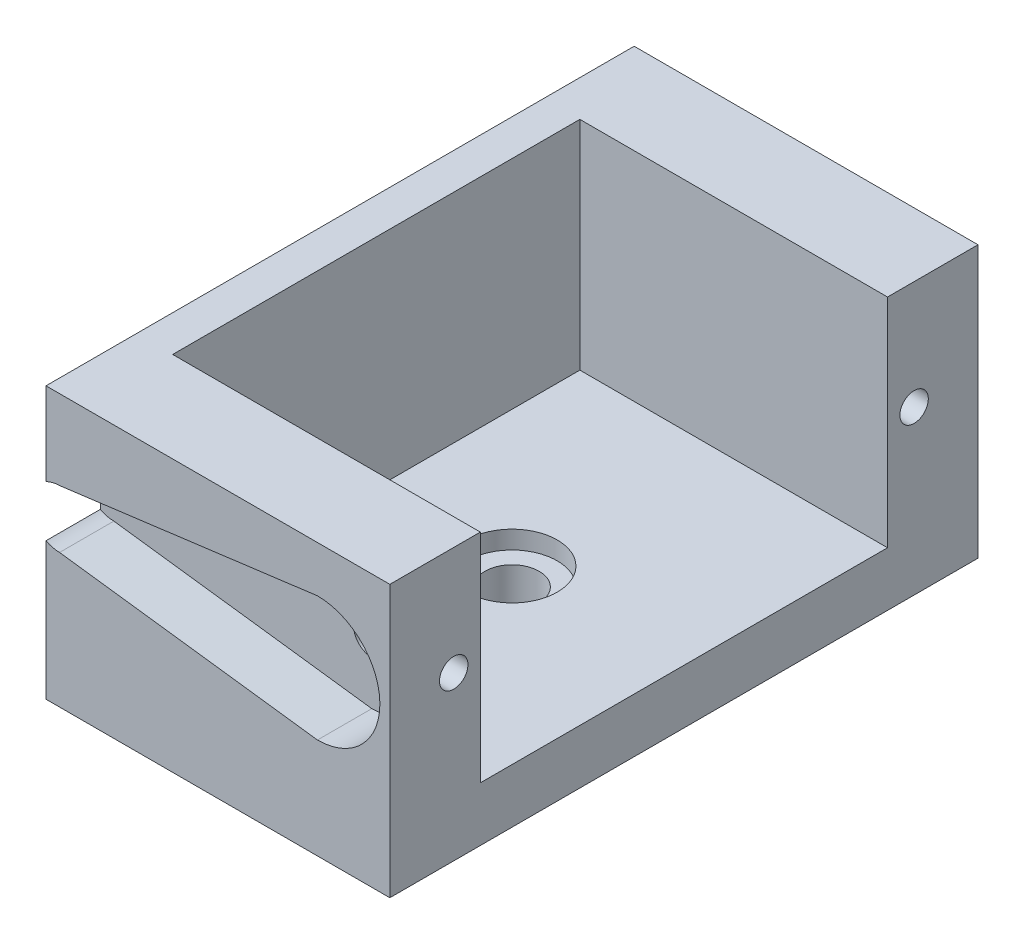
ISO-10303-21;
HEADER;
FILE_DESCRIPTION(('STEP AP214'),'2;1');
FILE_NAME('part.step','',(''),(''),'','','');
FILE_SCHEMA(('AUTOMOTIVE_DESIGN { 1 0 10303 214 1 1 1 1 }'));
ENDSEC;
DATA;
#1=APPLICATION_CONTEXT('core data for automotive mechanical design processes');
#2=APPLICATION_PROTOCOL_DEFINITION('international standard','automotive_design',2000,#1);
#3=PRODUCT_CONTEXT('',#1,'mechanical');
#4=PRODUCT('Part','Part','',(#3));
#5=PRODUCT_RELATED_PRODUCT_CATEGORY('part','',(#4));
#6=PRODUCT_DEFINITION_FORMATION('','',#4);
#7=PRODUCT_DEFINITION_CONTEXT('part definition',#1,'design');
#8=PRODUCT_DEFINITION('design','',#6,#7);
#9=PRODUCT_DEFINITION_SHAPE('','',#8);
#10=(LENGTH_UNIT() NAMED_UNIT(*) SI_UNIT(.MILLI.,.METRE.));
#11=(NAMED_UNIT(*) PLANE_ANGLE_UNIT() SI_UNIT($,.RADIAN.));
#12=(NAMED_UNIT(*) SI_UNIT($,.STERADIAN.) SOLID_ANGLE_UNIT());
#13=UNCERTAINTY_MEASURE_WITH_UNIT(LENGTH_MEASURE(1.E-05),#10,'distance_accuracy_value','');
#14=(GEOMETRIC_REPRESENTATION_CONTEXT(3) GLOBAL_UNCERTAINTY_ASSIGNED_CONTEXT((#13)) GLOBAL_UNIT_ASSIGNED_CONTEXT((#10,
#11,#12)) REPRESENTATION_CONTEXT('',''));
#15=CARTESIAN_POINT('',(0.,0.,0.));
#16=DIRECTION('',(0.,0.,1.));
#17=DIRECTION('',(1.,0.,0.));
#18=AXIS2_PLACEMENT_3D('',#15,#16,#17);
#19=CARTESIAN_POINT('',(9.50000000000006,-6.,0.));
#20=DIRECTION('',(0.,-1.,0.));
#21=DIRECTION('',(0.,0.,-1.));
#22=AXIS2_PLACEMENT_3D('',#19,#20,#21);
#23=CYLINDRICAL_SURFACE('',#22,1.5);
#24=CARTESIAN_POINT('',(9.50000000000006,-9.,0.));
#25=DIRECTION('',(0.,-1.,0.));
#26=DIRECTION('',(0.,0.,-1.));
#27=AXIS2_PLACEMENT_3D('',#24,#25,#26);
#28=CIRCLE('',#27,1.5);
#29=CARTESIAN_POINT('',(9.50000000000006,-9.,-1.5));
#30=VERTEX_POINT('',#29);
#31=EDGE_CURVE('E199',#30,#30,#28,.T.);
#32=ORIENTED_EDGE('',*,*,#31,.T.);
#33=EDGE_LOOP('',(#32));
#34=FACE_BOUND('',#33,.T.);
#35=CARTESIAN_POINT('',(9.50000000000006,-7.,0.));
#36=DIRECTION('',(0.,1.,0.));
#37=DIRECTION('',(0.,0.,1.));
#38=AXIS2_PLACEMENT_3D('',#35,#36,#37);
#39=CIRCLE('',#38,1.5);
#40=CARTESIAN_POINT('',(9.50000000000006,-7.,1.5));
#41=VERTEX_POINT('',#40);
#42=EDGE_CURVE('E51',#41,#41,#39,.F.);
#43=ORIENTED_EDGE('',*,*,#42,.F.);
#44=EDGE_LOOP('',(#43));
#45=FACE_BOUND('',#44,.T.);
#46=ADVANCED_FACE('F47',(#34,#45),#23,.F.);
#47=CARTESIAN_POINT('',(15.,0.,10.25));
#48=DIRECTION('',(0.,0.,1.));
#49=DIRECTION('',(1.,0.,0.));
#50=AXIS2_PLACEMENT_3D('',#47,#48,#49);
#51=CYLINDRICAL_SURFACE('',#50,1.);
#52=CARTESIAN_POINT('',(15.,0.,13.25));
#53=DIRECTION('',(0.,0.,1.));
#54=DIRECTION('',(1.,0.,0.));
#55=AXIS2_PLACEMENT_3D('',#52,#53,#54);
#56=CIRCLE('',#55,1.);
#57=CARTESIAN_POINT('',(16.,0.,13.25));
#58=VERTEX_POINT('',#57);
#59=EDGE_CURVE('E217',#58,#58,#56,.T.);
#60=ORIENTED_EDGE('',*,*,#59,.T.);
#61=EDGE_LOOP('',(#60));
#62=FACE_BOUND('',#61,.T.);
#63=CARTESIAN_POINT('',(15.,0.,11.75));
#64=DIRECTION('',(0.,0.,-1.));
#65=DIRECTION('',(-1.,0.,0.));
#66=AXIS2_PLACEMENT_3D('',#63,#64,#65);
#67=CIRCLE('',#66,1.);
#68=CARTESIAN_POINT('',(14.,0.,11.75));
#69=VERTEX_POINT('',#68);
#70=EDGE_CURVE('E213',#69,#69,#67,.F.);
#71=ORIENTED_EDGE('',*,*,#70,.F.);
#72=EDGE_LOOP('',(#71));
#73=FACE_BOUND('',#72,.T.);
#74=ADVANCED_FACE('F403',(#62,#73),#51,.F.);
#75=CARTESIAN_POINT('',(16.,0.,12.72));
#76=DIRECTION('',(1.,0.,0.));
#77=DIRECTION('',(0.,0.,-1.));
#78=AXIS2_PLACEMENT_3D('',#75,#76,#77);
#79=CYLINDRICAL_SURFACE('',#78,0.784999999999999);
#80=CARTESIAN_POINT('',(19.,0.,12.72));
#81=DIRECTION('',(1.,0.,0.));
#82=DIRECTION('',(0.,0.,-1.));
#83=AXIS2_PLACEMENT_3D('',#80,#81,#82);
#84=CIRCLE('',#83,0.784999999999999);
#85=CARTESIAN_POINT('',(19.,0.,11.935));
#86=VERTEX_POINT('',#85);
#87=EDGE_CURVE('E295',#86,#86,#84,.T.);
#88=ORIENTED_EDGE('',*,*,#87,.T.);
#89=EDGE_LOOP('',(#88));
#90=FACE_BOUND('',#89,.T.);
#91=DIRECTION('',(1.,0.,0.));
#92=VECTOR('',#91,1.);
#93=CARTESIAN_POINT('',(16.,0.579072534316729,13.25));
#94=LINE('',#93,#92);
#95=CARTESIAN_POINT('',(17.,0.579072534316729,13.25));
#96=VERTEX_POINT('',#95);
#97=CARTESIAN_POINT('',(18.4010549833838,0.579072534316729,13.25));
#98=VERTEX_POINT('',#97);
#99=EDGE_CURVE('E273',#96,#98,#94,.T.);
#100=ORIENTED_EDGE('',*,*,#99,.F.);
#101=CARTESIAN_POINT('',(17.,0.,12.72));
#102=DIRECTION('',(1.,0.,0.));
#103=DIRECTION('',(0.,0.,-1.));
#104=AXIS2_PLACEMENT_3D('',#101,#102,#103);
#105=CIRCLE('',#104,0.784999999999999);
#106=CARTESIAN_POINT('',(17.,-0.579072534316729,13.25));
#107=VERTEX_POINT('',#106);
#108=EDGE_CURVE('E224',#107,#96,#105,.T.);
#109=ORIENTED_EDGE('',*,*,#108,.F.);
#110=DIRECTION('',(1.,0.,0.));
#111=VECTOR('',#110,1.);
#112=CARTESIAN_POINT('',(16.,-0.579072534316729,13.25));
#113=LINE('',#112,#111);
#114=CARTESIAN_POINT('',(18.4010549833838,-0.579072534316729,13.25));
#115=VERTEX_POINT('',#114);
#116=EDGE_CURVE('E291',#115,#107,#113,.F.);
#117=ORIENTED_EDGE('',*,*,#116,.F.);
#118=CARTESIAN_POINT('',(18.4010549833838,-0.579072534316729,13.25));
#119=CARTESIAN_POINT('',(18.4061274127915,-0.54935305613086,13.2825177279916));
#120=CARTESIAN_POINT('',(18.4112484688931,-0.516857908328356,13.3124850077343));
#121=CARTESIAN_POINT('',(18.4210605751261,-0.447275442836323,13.3666061417337));
#122=CARTESIAN_POINT('',(18.4257515512325,-0.410187337183928,13.3907589963758));
#123=CARTESIAN_POINT('',(18.4341779514676,-0.332353722731534,13.4325460247221));
#124=CARTESIAN_POINT('',(18.4379125051583,-0.291604927574712,13.4501742668396));
#125=CARTESIAN_POINT('',(18.4440021609446,-0.207645046370179,13.4783315159908));
#126=CARTESIAN_POINT('',(18.4463579758924,-0.164435245445659,13.4888641920867));
#127=CARTESIAN_POINT('',(18.4493997818492,-0.0774850176345761,13.5023853226674));
#128=CARTESIAN_POINT('',(18.4501112676858,-0.0337634062835511,13.505488989142));
#129=CARTESIAN_POINT('',(18.4498602692343,0.0535823294500656,13.5043859136137));
#130=CARTESIAN_POINT('',(18.4488978407006,0.0972064570311668,13.5001794150963));
#131=CARTESIAN_POINT('',(18.4454309128946,0.182492220623079,13.4847053702288));
#132=CARTESIAN_POINT('',(18.4429478369312,0.224172611601393,13.4735358818806));
#133=CARTESIAN_POINT('',(18.4367248340911,0.305075859880942,13.4445696814052));
#134=CARTESIAN_POINT('',(18.4329844956679,0.344297907485004,13.426770799036));
#135=CARTESIAN_POINT('',(18.4247111651287,0.418598358127728,13.3854135514802));
#136=CARTESIAN_POINT('',(18.4201926735741,0.453735698185135,13.3619578572579));
#137=CARTESIAN_POINT('',(18.4107856974013,0.519780859085103,13.3097748687237));
#138=CARTESIAN_POINT('',(18.4058972918998,0.550689580389113,13.2810486997906));
#139=CARTESIAN_POINT('',(18.4010549833838,0.579072534316728,13.25));
#140=B_SPLINE_CURVE_WITH_KNOTS('',3,(#118,#119,#120,#121,#122,#123,#124,#125,#126,#127,#128,
#129,#130,#131,#132,#133,#134,#135,#136,#137,#138,#139),.UNSPECIFIED.,.F.,.F.,(4,2,2,2,2,2,2,2,
2,2,4),(0.,0.132874128128427,0.265771083660238,0.398788562022275,0.531737205173857,
0.662610276606591,0.793478989030575,0.922545096492923,1.0516534930723,1.17857484020827,
1.3054691179228),.UNSPECIFIED.);
#141=EDGE_CURVE('E11',#115,#98,#140,.T.);
#142=ORIENTED_EDGE('',*,*,#141,.T.);
#143=EDGE_LOOP('',(#100,#109,#117,#142));
#144=FACE_BOUND('',#143,.T.);
#145=ADVANCED_FACE('F369',(#90,#144),#79,.F.);
#146=CARTESIAN_POINT('',(19.,0.,11.25));
#147=DIRECTION('',(0.,0.,1.));
#148=DIRECTION('',(1.,0.,0.));
#149=AXIS2_PLACEMENT_3D('',#146,#147,#148);
#150=PLANE('',#149);
#151=CARTESIAN_POINT('',(15.,0.,11.25));
#152=DIRECTION('',(0.,0.,-1.));
#153=DIRECTION('',(-1.,0.,0.));
#154=AXIS2_PLACEMENT_3D('',#151,#152,#153);
#155=CIRCLE('',#154,1.5);
#156=CARTESIAN_POINT('',(13.5,0.,11.25));
#157=VERTEX_POINT('',#156);
#158=EDGE_CURVE('E207',#157,#157,#155,.T.);
#159=ORIENTED_EDGE('',*,*,#158,.F.);
#160=EDGE_LOOP('',(#159));
#161=FACE_BOUND('',#160,.T.);
#162=DIRECTION('',(0.,-1.,0.));
#163=VECTOR('',#162,1.);
#164=CARTESIAN_POINT('',(2.,0.,11.25));
#165=LINE('',#164,#163);
#166=CARTESIAN_POINT('',(2.,6.,11.25));
#167=VERTEX_POINT('',#166);
#168=CARTESIAN_POINT('',(2.,-6.,11.25));
#169=VERTEX_POINT('',#168);
#170=EDGE_CURVE('E358',#167,#169,#165,.T.);
#171=ORIENTED_EDGE('',*,*,#170,.F.);
#172=DIRECTION('',(-1.,0.,0.));
#173=VECTOR('',#172,1.);
#174=CARTESIAN_POINT('',(19.,6.,11.25));
#175=LINE('',#174,#173);
#176=CARTESIAN_POINT('',(19.,6.,11.25));
#177=VERTEX_POINT('',#176);
#178=EDGE_CURVE('E341',#177,#167,#175,.T.);
#179=ORIENTED_EDGE('',*,*,#178,.F.);
#180=DIRECTION('',(0.,1.,0.));
#181=VECTOR('',#180,1.);
#182=CARTESIAN_POINT('',(19.,0.,11.25));
#183=LINE('',#182,#181);
#184=CARTESIAN_POINT('',(19.,-6.,11.25));
#185=VERTEX_POINT('',#184);
#186=EDGE_CURVE('E338',#185,#177,#183,.T.);
#187=ORIENTED_EDGE('',*,*,#186,.F.);
#188=DIRECTION('',(-1.,0.,0.));
#189=VECTOR('',#188,1.);
#190=CARTESIAN_POINT('',(19.,-6.,11.25));
#191=LINE('',#190,#189);
#192=EDGE_CURVE('E350',#185,#169,#191,.T.);
#193=ORIENTED_EDGE('',*,*,#192,.T.);
#194=EDGE_LOOP('',(#171,#179,#187,#193));
#195=FACE_BOUND('',#194,.T.);
#196=ADVANCED_FACE('F479',(#161,#195),#150,.F.);
#197=CARTESIAN_POINT('',(19.,6.,0.));
#198=DIRECTION('',(0.,1.,0.));
#199=DIRECTION('',(0.,0.,1.));
#200=AXIS2_PLACEMENT_3D('',#197,#198,#199);
#201=PLANE('',#200);
#202=DIRECTION('',(0.,0.,-1.));
#203=VECTOR('',#202,1.);
#204=CARTESIAN_POINT('',(2.,6.,-16.25));
#205=LINE('',#204,#203);
#206=CARTESIAN_POINT('',(2.,6.,-11.25));
#207=VERTEX_POINT('',#206);
#208=EDGE_CURVE('E322',#167,#207,#205,.T.);
#209=ORIENTED_EDGE('',*,*,#208,.T.);
#210=DIRECTION('',(-1.,0.,0.));
#211=VECTOR('',#210,1.);
#212=CARTESIAN_POINT('',(19.,6.,-11.25));
#213=LINE('',#212,#211);
#214=CARTESIAN_POINT('',(19.,6.,-11.25));
#215=VERTEX_POINT('',#214);
#216=EDGE_CURVE('E73',#215,#207,#213,.T.);
#217=ORIENTED_EDGE('',*,*,#216,.F.);
#218=DIRECTION('',(0.,0.,-1.));
#219=VECTOR('',#218,1.);
#220=CARTESIAN_POINT('',(19.,6.,0.));
#221=LINE('',#220,#219);
#222=CARTESIAN_POINT('',(19.,6.,-16.25));
#223=VERTEX_POINT('',#222);
#224=EDGE_CURVE('E308',#215,#223,#221,.T.);
#225=ORIENTED_EDGE('',*,*,#224,.T.);
#226=DIRECTION('',(-1.,0.,0.));
#227=VECTOR('',#226,1.);
#228=CARTESIAN_POINT('',(2.,6.,-16.25));
#229=LINE('',#228,#227);
#230=CARTESIAN_POINT('',(0.,6.,-16.25));
#231=VERTEX_POINT('',#230);
#232=EDGE_CURVE('E325',#223,#231,#229,.T.);
#233=ORIENTED_EDGE('',*,*,#232,.T.);
#234=DIRECTION('',(0.,0.,-1.));
#235=VECTOR('',#234,1.);
#236=CARTESIAN_POINT('',(0.,6.,0.));
#237=LINE('',#236,#235);
#238=CARTESIAN_POINT('',(0.,6.,16.25));
#239=VERTEX_POINT('',#238);
#240=EDGE_CURVE('E173',#239,#231,#237,.T.);
#241=ORIENTED_EDGE('',*,*,#240,.F.);
#242=DIRECTION('',(-1.,0.,0.));
#243=VECTOR('',#242,1.);
#244=CARTESIAN_POINT('',(19.,6.,16.25));
#245=LINE('',#244,#243);
#246=CARTESIAN_POINT('',(19.,6.,16.25));
#247=VERTEX_POINT('',#246);
#248=EDGE_CURVE('E354',#247,#239,#245,.T.);
#249=ORIENTED_EDGE('',*,*,#248,.F.);
#250=DIRECTION('',(0.,0.,-1.));
#251=VECTOR('',#250,1.);
#252=CARTESIAN_POINT('',(19.,6.,0.));
#253=LINE('',#252,#251);
#254=EDGE_CURVE('E329',#247,#177,#253,.T.);
#255=ORIENTED_EDGE('',*,*,#254,.T.);
#256=ORIENTED_EDGE('',*,*,#178,.T.);
#257=EDGE_LOOP('',(#209,#217,#225,#233,#241,#249,#255,#256));
#258=FACE_BOUND('',#257,.T.);
#259=ADVANCED_FACE('F49',(#258),#201,.T.);
#260=CARTESIAN_POINT('',(19.,0.,16.25));
#261=DIRECTION('',(0.,0.,1.));
#262=DIRECTION('',(1.,0.,0.));
#263=AXIS2_PLACEMENT_3D('',#260,#261,#262);
#264=PLANE('',#263);
#265=CARTESIAN_POINT('',(0.749999999999999,0.,16.25));
#266=DIRECTION('',(0.,0.,1.));
#267=DIRECTION('',(1.,0.,0.));
#268=AXIS2_PLACEMENT_3D('',#265,#266,#267);
#269=CIRCLE('',#268,1.6);
#270=CARTESIAN_POINT('',(0.,-1.41332940251026,16.25));
#271=VERTEX_POINT('',#270);
#272=CARTESIAN_POINT('',(0.749999999999999,-1.6,16.25));
#273=VERTEX_POINT('',#272);
#274=EDGE_CURVE('E259',#271,#273,#269,.T.);
#275=ORIENTED_EDGE('',*,*,#274,.F.);
#276=DIRECTION('',(0.,1.,0.));
#277=VECTOR('',#276,1.);
#278=CARTESIAN_POINT('',(0.,0.,16.25));
#279=LINE('',#278,#277);
#280=CARTESIAN_POINT('',(0.,-9.,16.25));
#281=VERTEX_POINT('',#280);
#282=EDGE_CURVE('E334',#281,#271,#279,.T.);
#283=ORIENTED_EDGE('',*,*,#282,.F.);
#284=DIRECTION('',(-1.,0.,0.));
#285=VECTOR('',#284,1.);
#286=CARTESIAN_POINT('',(0.,-9.,16.25));
#287=LINE('',#286,#285);
#288=CARTESIAN_POINT('',(19.,-9.,16.25));
#289=VERTEX_POINT('',#288);
#290=EDGE_CURVE('E193',#289,#281,#287,.T.);
#291=ORIENTED_EDGE('',*,*,#290,.F.);
#292=DIRECTION('',(0.,1.,0.));
#293=VECTOR('',#292,1.);
#294=CARTESIAN_POINT('',(19.,0.,16.25));
#295=LINE('',#294,#293);
#296=EDGE_CURVE('E333',#289,#247,#295,.T.);
#297=ORIENTED_EDGE('',*,*,#296,.T.);
#298=ORIENTED_EDGE('',*,*,#248,.T.);
#299=CARTESIAN_POINT('',(0.,1.41332940251026,16.25));
#300=VERTEX_POINT('',#299);
#301=EDGE_CURVE('E344',#300,#239,#279,.T.);
#302=ORIENTED_EDGE('',*,*,#301,.F.);
#303=CARTESIAN_POINT('',(0.749999999999999,0.,16.25));
#304=DIRECTION('',(0.,0.,1.));
#305=DIRECTION('',(1.,0.,0.));
#306=AXIS2_PLACEMENT_3D('',#303,#304,#305);
#307=CIRCLE('',#306,1.6);
#308=CARTESIAN_POINT('',(0.749999999999999,1.6,16.25));
#309=VERTEX_POINT('',#308);
#310=EDGE_CURVE('E256',#309,#300,#307,.T.);
#311=ORIENTED_EDGE('',*,*,#310,.F.);
#312=DIRECTION('',(0.991677843920088,0.128744141140503,0.));
#313=VECTOR('',#312,1.);
#314=CARTESIAN_POINT('',(-0.191845049277187,1.47772537956752,16.25));
#315=LINE('',#314,#313);
#316=CARTESIAN_POINT('',(15.,3.45,16.25));
#317=VERTEX_POINT('',#316);
#318=EDGE_CURVE('E228',#309,#317,#315,.T.);
#319=ORIENTED_EDGE('',*,*,#318,.T.);
#320=CARTESIAN_POINT('',(15.,0.,16.25));
#321=DIRECTION('',(0.,0.,1.));
#322=DIRECTION('',(1.,0.,0.));
#323=AXIS2_PLACEMENT_3D('',#320,#321,#322);
#324=CIRCLE('',#323,3.45);
#325=CARTESIAN_POINT('',(15.,-3.45,16.25));
#326=VERTEX_POINT('',#325);
#327=EDGE_CURVE('E233',#326,#317,#324,.T.);
#328=ORIENTED_EDGE('',*,*,#327,.F.);
#329=DIRECTION('',(0.991677843920088,-0.128744141140503,0.));
#330=VECTOR('',#329,1.);
#331=CARTESIAN_POINT('',(-0.191845049277188,-1.47772537956752,16.25));
#332=LINE('',#331,#330);
#333=EDGE_CURVE('E263',#273,#326,#332,.T.);
#334=ORIENTED_EDGE('',*,*,#333,.F.);
#335=EDGE_LOOP('',(#275,#283,#291,#297,#298,#302,#311,#319,#328,#334));
#336=FACE_BOUND('',#335,.T.);
#337=ADVANCED_FACE('F457',(#336),#264,.T.);
#338=CARTESIAN_POINT('',(19.,0.,0.));
#339=DIRECTION('',(1.,0.,0.));
#340=DIRECTION('',(0.,0.,-1.));
#341=AXIS2_PLACEMENT_3D('',#338,#339,#340);
#342=PLANE('',#341);
#343=ORIENTED_EDGE('',*,*,#87,.F.);
#344=EDGE_LOOP('',(#343));
#345=FACE_BOUND('',#344,.T.);
#346=ORIENTED_EDGE('',*,*,#254,.F.);
#347=ORIENTED_EDGE('',*,*,#296,.F.);
#348=DIRECTION('',(0.,0.,1.));
#349=VECTOR('',#348,1.);
#350=CARTESIAN_POINT('',(19.,-9.,16.25));
#351=LINE('',#350,#349);
#352=CARTESIAN_POINT('',(19.,-9.,-16.25));
#353=VERTEX_POINT('',#352);
#354=EDGE_CURVE('E188',#353,#289,#351,.T.);
#355=ORIENTED_EDGE('',*,*,#354,.F.);
#356=DIRECTION('',(0.,1.,0.));
#357=VECTOR('',#356,1.);
#358=CARTESIAN_POINT('',(19.,0.,-16.25));
#359=LINE('',#358,#357);
#360=EDGE_CURVE('E183',#353,#223,#359,.T.);
#361=ORIENTED_EDGE('',*,*,#360,.T.);
#362=ORIENTED_EDGE('',*,*,#224,.F.);
#363=DIRECTION('',(0.,1.,0.));
#364=VECTOR('',#363,1.);
#365=CARTESIAN_POINT('',(19.,0.,-11.25));
#366=LINE('',#365,#364);
#367=CARTESIAN_POINT('',(19.,-6.,-11.25));
#368=VERTEX_POINT('',#367);
#369=EDGE_CURVE('E312',#368,#215,#366,.T.);
#370=ORIENTED_EDGE('',*,*,#369,.F.);
#371=DIRECTION('',(0.,0.,1.));
#372=VECTOR('',#371,1.);
#373=CARTESIAN_POINT('',(19.,-6.,16.25));
#374=LINE('',#373,#372);
#375=EDGE_CURVE('E195',#368,#185,#374,.T.);
#376=ORIENTED_EDGE('',*,*,#375,.T.);
#377=ORIENTED_EDGE('',*,*,#186,.T.);
#378=EDGE_LOOP('',(#346,#347,#355,#361,#362,#370,#376,#377));
#379=FACE_BOUND('',#378,.T.);
#380=CARTESIAN_POINT('',(19.,0.,-12.72));
#381=DIRECTION('',(1.,0.,0.));
#382=DIRECTION('',(0.,0.,-1.));
#383=AXIS2_PLACEMENT_3D('',#380,#381,#382);
#384=CIRCLE('',#383,0.784999999999999);
#385=CARTESIAN_POINT('',(19.,0.,-13.505));
#386=VERTEX_POINT('',#385);
#387=EDGE_CURVE('E294',#386,#386,#384,.T.);
#388=ORIENTED_EDGE('',*,*,#387,.F.);
#389=EDGE_LOOP('',(#388));
#390=FACE_BOUND('',#389,.T.);
#391=ADVANCED_FACE('F462',(#345,#379,#390),#342,.T.);
#392=CARTESIAN_POINT('',(0.,0.,0.));
#393=DIRECTION('',(1.,0.,0.));
#394=DIRECTION('',(0.,0.,-1.));
#395=AXIS2_PLACEMENT_3D('',#392,#393,#394);
#396=PLANE('',#395);
#397=ORIENTED_EDGE('',*,*,#282,.T.);
#398=DIRECTION('',(0.,0.,1.));
#399=VECTOR('',#398,1.);
#400=CARTESIAN_POINT('',(0.,-1.41332940251026,13.25));
#401=LINE('',#400,#399);
#402=CARTESIAN_POINT('',(0.,-1.41332940251026,13.25));
#403=VERTEX_POINT('',#402);
#404=EDGE_CURVE('E280',#403,#271,#401,.T.);
#405=ORIENTED_EDGE('',*,*,#404,.F.);
#406=DIRECTION('',(0.,-1.,0.));
#407=VECTOR('',#406,1.);
#408=CARTESIAN_POINT('',(0.,0.,13.25));
#409=LINE('',#408,#407);
#410=CARTESIAN_POINT('',(0.,1.41332940251026,13.25));
#411=VERTEX_POINT('',#410);
#412=EDGE_CURVE('E236',#411,#403,#409,.T.);
#413=ORIENTED_EDGE('',*,*,#412,.F.);
#414=DIRECTION('',(0.,0.,1.));
#415=VECTOR('',#414,1.);
#416=CARTESIAN_POINT('',(0.,1.41332940251026,13.25));
#417=LINE('',#416,#415);
#418=EDGE_CURVE('E283',#411,#300,#417,.T.);
#419=ORIENTED_EDGE('',*,*,#418,.T.);
#420=ORIENTED_EDGE('',*,*,#301,.T.);
#421=ORIENTED_EDGE('',*,*,#240,.T.);
#422=DIRECTION('',(0.,-1.,0.));
#423=VECTOR('',#422,1.);
#424=CARTESIAN_POINT('',(0.,6.,-16.25));
#425=LINE('',#424,#423);
#426=CARTESIAN_POINT('',(0.,-9.,-16.25));
#427=VERTEX_POINT('',#426);
#428=EDGE_CURVE('E166',#231,#427,#425,.T.);
#429=ORIENTED_EDGE('',*,*,#428,.T.);
#430=DIRECTION('',(0.,0.,-1.));
#431=VECTOR('',#430,1.);
#432=CARTESIAN_POINT('',(0.,-9.,16.25));
#433=LINE('',#432,#431);
#434=EDGE_CURVE('E171',#281,#427,#433,.T.);
#435=ORIENTED_EDGE('',*,*,#434,.F.);
#436=EDGE_LOOP('',(#397,#405,#413,#419,#420,#421,#429,#435));
#437=FACE_BOUND('',#436,.T.);
#438=ADVANCED_FACE('F169',(#437),#396,.F.);
#439=CARTESIAN_POINT('',(2.,0.,0.));
#440=DIRECTION('',(-1.,0.,0.));
#441=DIRECTION('',(0.,0.,1.));
#442=AXIS2_PLACEMENT_3D('',#439,#440,#441);
#443=PLANE('',#442);
#444=DIRECTION('',(0.,0.,1.));
#445=VECTOR('',#444,1.);
#446=CARTESIAN_POINT('',(2.,-6.,-16.25));
#447=LINE('',#446,#445);
#448=CARTESIAN_POINT('',(2.,-6.,-11.25));
#449=VERTEX_POINT('',#448);
#450=EDGE_CURVE('E177',#449,#169,#447,.T.);
#451=ORIENTED_EDGE('',*,*,#450,.F.);
#452=DIRECTION('',(0.,1.,0.));
#453=VECTOR('',#452,1.);
#454=CARTESIAN_POINT('',(2.,0.,-11.25));
#455=LINE('',#454,#453);
#456=EDGE_CURVE('E57',#449,#207,#455,.T.);
#457=ORIENTED_EDGE('',*,*,#456,.T.);
#458=ORIENTED_EDGE('',*,*,#208,.F.);
#459=ORIENTED_EDGE('',*,*,#170,.T.);
#460=EDGE_LOOP('',(#451,#457,#458,#459));
#461=FACE_BOUND('',#460,.T.);
#462=ADVANCED_FACE('F475',(#461),#443,.F.);
#463=CARTESIAN_POINT('',(2.,6.,-16.25));
#464=DIRECTION('',(0.,0.,-1.));
#465=DIRECTION('',(-1.,0.,0.));
#466=AXIS2_PLACEMENT_3D('',#463,#464,#465);
#467=PLANE('',#466);
#468=ORIENTED_EDGE('',*,*,#428,.F.);
#469=ORIENTED_EDGE('',*,*,#232,.F.);
#470=ORIENTED_EDGE('',*,*,#360,.F.);
#471=DIRECTION('',(1.,0.,0.));
#472=VECTOR('',#471,1.);
#473=CARTESIAN_POINT('',(0.,-9.,-16.25));
#474=LINE('',#473,#472);
#475=EDGE_CURVE('E180',#427,#353,#474,.T.);
#476=ORIENTED_EDGE('',*,*,#475,.F.);
#477=EDGE_LOOP('',(#468,#469,#470,#476));
#478=FACE_BOUND('',#477,.T.);
#479=ADVANCED_FACE('F181',(#478),#467,.T.);
#480=CARTESIAN_POINT('',(19.,0.,-11.25));
#481=DIRECTION('',(0.,0.,1.));
#482=DIRECTION('',(1.,0.,0.));
#483=AXIS2_PLACEMENT_3D('',#480,#481,#482);
#484=PLANE('',#483);
#485=ORIENTED_EDGE('',*,*,#456,.F.);
#486=DIRECTION('',(-1.,0.,0.));
#487=VECTOR('',#486,1.);
#488=CARTESIAN_POINT('',(19.,-6.,-11.25));
#489=LINE('',#488,#487);
#490=EDGE_CURVE('E315',#368,#449,#489,.T.);
#491=ORIENTED_EDGE('',*,*,#490,.F.);
#492=ORIENTED_EDGE('',*,*,#369,.T.);
#493=ORIENTED_EDGE('',*,*,#216,.T.);
#494=EDGE_LOOP('',(#485,#491,#492,#493));
#495=FACE_BOUND('',#494,.T.);
#496=ADVANCED_FACE('F477',(#495),#484,.T.);
#497=CARTESIAN_POINT('',(16.,0.,-12.72));
#498=DIRECTION('',(1.,0.,0.));
#499=DIRECTION('',(0.,0.,-1.));
#500=AXIS2_PLACEMENT_3D('',#497,#498,#499);
#501=CYLINDRICAL_SURFACE('',#500,0.784999999999999);
#502=CARTESIAN_POINT('',(16.,0.,-12.72));
#503=DIRECTION('',(1.,0.,0.));
#504=DIRECTION('',(0.,0.,-1.));
#505=AXIS2_PLACEMENT_3D('',#502,#503,#504);
#506=CIRCLE('',#505,0.784999999999999);
#507=CARTESIAN_POINT('',(16.,0.,-13.505));
#508=VERTEX_POINT('',#507);
#509=EDGE_CURVE('E299',#508,#508,#506,.T.);
#510=ORIENTED_EDGE('',*,*,#509,.F.);
#511=EDGE_LOOP('',(#510));
#512=FACE_BOUND('',#511,.T.);
#513=ORIENTED_EDGE('',*,*,#387,.T.);
#514=EDGE_LOOP('',(#513));
#515=FACE_BOUND('',#514,.T.);
#516=ADVANCED_FACE('F506',(#512,#515),#501,.F.);
#517=CARTESIAN_POINT('',(16.,0.,0.));
#518=DIRECTION('',(1.,0.,0.));
#519=DIRECTION('',(0.,0.,-1.));
#520=AXIS2_PLACEMENT_3D('',#517,#518,#519);
#521=PLANE('',#520);
#522=ORIENTED_EDGE('',*,*,#509,.T.);
#523=EDGE_LOOP('',(#522));
#524=FACE_BOUND('',#523,.T.);
#525=ADVANCED_FACE('F379',(#524),#521,.T.);
#526=CARTESIAN_POINT('',(15.,0.,13.25));
#527=DIRECTION('',(0.,0.,1.));
#528=DIRECTION('',(1.,0.,0.));
#529=AXIS2_PLACEMENT_3D('',#526,#527,#528);
#530=CYLINDRICAL_SURFACE('',#529,3.45);
#531=CARTESIAN_POINT('',(15.,0.,13.25));
#532=DIRECTION('',(0.,0.,1.));
#533=DIRECTION('',(1.,0.,0.));
#534=AXIS2_PLACEMENT_3D('',#531,#532,#533);
#535=CIRCLE('',#534,3.45);
#536=CARTESIAN_POINT('',(15.,-3.45,13.25));
#537=VERTEX_POINT('',#536);
#538=EDGE_CURVE('E248',#537,#115,#535,.T.);
#539=ORIENTED_EDGE('',*,*,#538,.F.);
#540=DIRECTION('',(0.,0.,1.));
#541=VECTOR('',#540,1.);
#542=CARTESIAN_POINT('',(15.,-3.45,13.25));
#543=LINE('',#542,#541);
#544=EDGE_CURVE('E274',#537,#326,#543,.T.);
#545=ORIENTED_EDGE('',*,*,#544,.T.);
#546=ORIENTED_EDGE('',*,*,#327,.T.);
#547=DIRECTION('',(0.,0.,1.));
#548=VECTOR('',#547,1.);
#549=CARTESIAN_POINT('',(15.,3.45,13.25));
#550=LINE('',#549,#548);
#551=CARTESIAN_POINT('',(15.,3.45,13.25));
#552=VERTEX_POINT('',#551);
#553=EDGE_CURVE('E270',#552,#317,#550,.T.);
#554=ORIENTED_EDGE('',*,*,#553,.F.);
#555=EDGE_CURVE('E247',#98,#552,#535,.T.);
#556=ORIENTED_EDGE('',*,*,#555,.F.);
#557=ORIENTED_EDGE('',*,*,#141,.F.);
#558=EDGE_LOOP('',(#539,#545,#546,#554,#556,#557));
#559=FACE_BOUND('',#558,.T.);
#560=ADVANCED_FACE('F373',(#559),#530,.F.);
#561=CARTESIAN_POINT('',(0.,0.,13.25));
#562=DIRECTION('',(0.,0.,1.));
#563=DIRECTION('',(1.,0.,0.));
#564=AXIS2_PLACEMENT_3D('',#561,#562,#563);
#565=PLANE('',#564);
#566=ORIENTED_EDGE('',*,*,#59,.F.);
#567=EDGE_LOOP('',(#566));
#568=FACE_BOUND('',#567,.T.);
#569=ORIENTED_EDGE('',*,*,#99,.T.);
#570=ORIENTED_EDGE('',*,*,#555,.T.);
#571=DIRECTION('',(0.991677843920088,0.128744141140503,0.));
#572=VECTOR('',#571,1.);
#573=CARTESIAN_POINT('',(-0.191845049277187,1.47772537956752,13.25));
#574=LINE('',#573,#572);
#575=CARTESIAN_POINT('',(0.749999999999999,1.6,13.25));
#576=VERTEX_POINT('',#575);
#577=EDGE_CURVE('E229',#576,#552,#574,.T.);
#578=ORIENTED_EDGE('',*,*,#577,.F.);
#579=CARTESIAN_POINT('',(0.749999999999999,0.,13.25));
#580=DIRECTION('',(0.,0.,1.));
#581=DIRECTION('',(1.,0.,0.));
#582=AXIS2_PLACEMENT_3D('',#579,#580,#581);
#583=CIRCLE('',#582,1.6);
#584=EDGE_CURVE('E65',#576,#411,#583,.T.);
#585=ORIENTED_EDGE('',*,*,#584,.T.);
#586=ORIENTED_EDGE('',*,*,#412,.T.);
#587=CARTESIAN_POINT('',(0.749999999999999,0.,13.25));
#588=DIRECTION('',(0.,0.,1.));
#589=DIRECTION('',(1.,0.,0.));
#590=AXIS2_PLACEMENT_3D('',#587,#588,#589);
#591=CIRCLE('',#590,1.6);
#592=CARTESIAN_POINT('',(0.749999999999999,-1.6,13.25));
#593=VERTEX_POINT('',#592);
#594=EDGE_CURVE('E239',#403,#593,#591,.T.);
#595=ORIENTED_EDGE('',*,*,#594,.T.);
#596=DIRECTION('',(0.991677843920088,-0.128744141140503,0.));
#597=VECTOR('',#596,1.);
#598=CARTESIAN_POINT('',(-0.191845049277188,-1.47772537956752,13.25));
#599=LINE('',#598,#597);
#600=EDGE_CURVE('E243',#593,#537,#599,.T.);
#601=ORIENTED_EDGE('',*,*,#600,.T.);
#602=ORIENTED_EDGE('',*,*,#538,.T.);
#603=ORIENTED_EDGE('',*,*,#116,.T.);
#604=DIRECTION('',(0.,1.,0.));
#605=VECTOR('',#604,1.);
#606=CARTESIAN_POINT('',(17.,0.,13.25));
#607=LINE('',#606,#605);
#608=EDGE_CURVE('E221',#107,#96,#607,.T.);
#609=ORIENTED_EDGE('',*,*,#608,.T.);
#610=EDGE_LOOP('',(#569,#570,#578,#585,#586,#595,#601,#602,#603,#609));
#611=FACE_BOUND('',#610,.T.);
#612=ADVANCED_FACE('F378',(#568,#611),#565,.T.);
#613=CARTESIAN_POINT('',(-0.191845049277187,1.47772537956752,13.25));
#614=DIRECTION('',(0.128744141140503,-0.991677843920088,0.));
#615=DIRECTION('',(0.991677843920088,0.128744141140503,0.));
#616=AXIS2_PLACEMENT_3D('',#613,#614,#615);
#617=PLANE('',#616);
#618=ORIENTED_EDGE('',*,*,#318,.F.);
#619=DIRECTION('',(0.,0.,1.));
#620=VECTOR('',#619,1.);
#621=CARTESIAN_POINT('',(0.749999999999999,1.6,13.25));
#622=LINE('',#621,#620);
#623=EDGE_CURVE('E252',#576,#309,#622,.T.);
#624=ORIENTED_EDGE('',*,*,#623,.F.);
#625=ORIENTED_EDGE('',*,*,#577,.T.);
#626=ORIENTED_EDGE('',*,*,#553,.T.);
#627=EDGE_LOOP('',(#618,#624,#625,#626));
#628=FACE_BOUND('',#627,.T.);
#629=ADVANCED_FACE('F386',(#628),#617,.T.);
#630=CARTESIAN_POINT('',(-0.191845049277188,-1.47772537956752,13.25));
#631=DIRECTION('',(-0.128744141140503,-0.991677843920088,0.));
#632=DIRECTION('',(0.991677843920088,-0.128744141140503,0.));
#633=AXIS2_PLACEMENT_3D('',#630,#631,#632);
#634=PLANE('',#633);
#635=ORIENTED_EDGE('',*,*,#333,.T.);
#636=ORIENTED_EDGE('',*,*,#544,.F.);
#637=ORIENTED_EDGE('',*,*,#600,.F.);
#638=DIRECTION('',(0.,0.,1.));
#639=VECTOR('',#638,1.);
#640=CARTESIAN_POINT('',(0.749999999999999,-1.6,13.25));
#641=LINE('',#640,#639);
#642=EDGE_CURVE('E277',#593,#273,#641,.T.);
#643=ORIENTED_EDGE('',*,*,#642,.T.);
#644=EDGE_LOOP('',(#635,#636,#637,#643));
#645=FACE_BOUND('',#644,.T.);
#646=ADVANCED_FACE('F382',(#645),#634,.F.);
#647=CARTESIAN_POINT('',(0.749999999999999,0.,13.25));
#648=DIRECTION('',(0.,0.,1.));
#649=DIRECTION('',(1.,0.,0.));
#650=AXIS2_PLACEMENT_3D('',#647,#648,#649);
#651=CYLINDRICAL_SURFACE('',#650,1.6);
#652=ORIENTED_EDGE('',*,*,#274,.T.);
#653=ORIENTED_EDGE('',*,*,#642,.F.);
#654=ORIENTED_EDGE('',*,*,#594,.F.);
#655=ORIENTED_EDGE('',*,*,#404,.T.);
#656=EDGE_LOOP('',(#652,#653,#654,#655));
#657=FACE_BOUND('',#656,.T.);
#658=ADVANCED_FACE('F385',(#657),#651,.F.);
#659=CARTESIAN_POINT('',(0.749999999999999,0.,13.25));
#660=DIRECTION('',(0.,0.,1.));
#661=DIRECTION('',(1.,0.,0.));
#662=AXIS2_PLACEMENT_3D('',#659,#660,#661);
#663=CYLINDRICAL_SURFACE('',#662,1.6);
#664=ORIENTED_EDGE('',*,*,#310,.T.);
#665=ORIENTED_EDGE('',*,*,#418,.F.);
#666=ORIENTED_EDGE('',*,*,#584,.F.);
#667=ORIENTED_EDGE('',*,*,#623,.T.);
#668=EDGE_LOOP('',(#664,#665,#666,#667));
#669=FACE_BOUND('',#668,.T.);
#670=ADVANCED_FACE('F390',(#669),#663,.F.);
#671=CARTESIAN_POINT('',(17.,0.,12.72));
#672=DIRECTION('',(1.,0.,0.));
#673=DIRECTION('',(0.,0.,-1.));
#674=AXIS2_PLACEMENT_3D('',#671,#672,#673);
#675=PLANE('',#674);
#676=ORIENTED_EDGE('',*,*,#608,.F.);
#677=ORIENTED_EDGE('',*,*,#108,.T.);
#678=EDGE_LOOP('',(#676,#677));
#679=FACE_BOUND('',#678,.T.);
#680=ADVANCED_FACE('F393',(#679),#675,.T.);
#681=CARTESIAN_POINT('',(15.,0.,11.75));
#682=DIRECTION('',(0.,0.,-1.));
#683=DIRECTION('',(-1.,0.,0.));
#684=AXIS2_PLACEMENT_3D('',#681,#682,#683);
#685=PLANE('',#684);
#686=CARTESIAN_POINT('',(15.,0.,11.75));
#687=DIRECTION('',(0.,0.,-1.));
#688=DIRECTION('',(-1.,0.,0.));
#689=AXIS2_PLACEMENT_3D('',#686,#687,#688);
#690=CIRCLE('',#689,1.5);
#691=CARTESIAN_POINT('',(13.5,0.,11.75));
#692=VERTEX_POINT('',#691);
#693=EDGE_CURVE('E209',#692,#692,#690,.T.);
#694=ORIENTED_EDGE('',*,*,#693,.T.);
#695=EDGE_LOOP('',(#694));
#696=FACE_BOUND('',#695,.T.);
#697=ORIENTED_EDGE('',*,*,#70,.T.);
#698=EDGE_LOOP('',(#697));
#699=FACE_BOUND('',#698,.T.);
#700=ADVANCED_FACE('F426',(#696,#699),#685,.T.);
#701=CARTESIAN_POINT('',(15.,0.,11.75));
#702=DIRECTION('',(0.,0.,-1.));
#703=DIRECTION('',(-1.,0.,0.));
#704=AXIS2_PLACEMENT_3D('',#701,#702,#703);
#705=CYLINDRICAL_SURFACE('',#704,1.5);
#706=ORIENTED_EDGE('',*,*,#693,.F.);
#707=EDGE_LOOP('',(#706));
#708=FACE_BOUND('',#707,.T.);
#709=ORIENTED_EDGE('',*,*,#158,.T.);
#710=EDGE_LOOP('',(#709));
#711=FACE_BOUND('',#710,.T.);
#712=ADVANCED_FACE('F424',(#708,#711),#705,.F.);
#713=CARTESIAN_POINT('',(0.,-6.,0.));
#714=DIRECTION('',(0.,-1.,0.));
#715=DIRECTION('',(0.,0.,-1.));
#716=AXIS2_PLACEMENT_3D('',#713,#714,#715);
#717=PLANE('',#716);
#718=CARTESIAN_POINT('',(9.50000000000006,-6.,0.));
#719=DIRECTION('',(0.,1.,0.));
#720=DIRECTION('',(0.,0.,1.));
#721=AXIS2_PLACEMENT_3D('',#718,#719,#720);
#722=CIRCLE('',#721,2.5);
#723=CARTESIAN_POINT('',(9.50000000000006,-6.,2.5));
#724=VERTEX_POINT('',#723);
#725=EDGE_CURVE('E632',#724,#724,#722,.T.);
#726=ORIENTED_EDGE('',*,*,#725,.F.);
#727=EDGE_LOOP('',(#726));
#728=FACE_BOUND('',#727,.T.);
#729=ORIENTED_EDGE('',*,*,#375,.F.);
#730=ORIENTED_EDGE('',*,*,#490,.T.);
#731=ORIENTED_EDGE('',*,*,#450,.T.);
#732=ORIENTED_EDGE('',*,*,#192,.F.);
#733=EDGE_LOOP('',(#729,#730,#731,#732));
#734=FACE_BOUND('',#733,.T.);
#735=ADVANCED_FACE('F421',(#728,#734),#717,.F.);
#736=CARTESIAN_POINT('',(0.,-9.,0.));
#737=DIRECTION('',(0.,-1.,0.));
#738=DIRECTION('',(0.,0.,-1.));
#739=AXIS2_PLACEMENT_3D('',#736,#737,#738);
#740=PLANE('',#739);
#741=ORIENTED_EDGE('',*,*,#31,.F.);
#742=EDGE_LOOP('',(#741));
#743=FACE_BOUND('',#742,.T.);
#744=ORIENTED_EDGE('',*,*,#434,.T.);
#745=ORIENTED_EDGE('',*,*,#475,.T.);
#746=ORIENTED_EDGE('',*,*,#354,.T.);
#747=ORIENTED_EDGE('',*,*,#290,.T.);
#748=EDGE_LOOP('',(#744,#745,#746,#747));
#749=FACE_BOUND('',#748,.T.);
#750=ADVANCED_FACE('F191',(#743,#749),#740,.T.);
#751=CARTESIAN_POINT('',(9.50000000000006,-7.,0.));
#752=DIRECTION('',(0.,1.,0.));
#753=DIRECTION('',(0.,0.,1.));
#754=AXIS2_PLACEMENT_3D('',#751,#752,#753);
#755=PLANE('',#754);
#756=CARTESIAN_POINT('',(9.50000000000006,-7.,0.));
#757=DIRECTION('',(0.,1.,0.));
#758=DIRECTION('',(0.,0.,1.));
#759=AXIS2_PLACEMENT_3D('',#756,#757,#758);
#760=CIRCLE('',#759,2.5);
#761=CARTESIAN_POINT('',(9.50000000000006,-7.,2.5));
#762=VERTEX_POINT('',#761);
#763=EDGE_CURVE('E629',#762,#762,#760,.T.);
#764=ORIENTED_EDGE('',*,*,#763,.T.);
#765=EDGE_LOOP('',(#764));
#766=FACE_BOUND('',#765,.T.);
#767=ORIENTED_EDGE('',*,*,#42,.T.);
#768=EDGE_LOOP('',(#767));
#769=FACE_BOUND('',#768,.T.);
#770=ADVANCED_FACE('F420',(#766,#769),#755,.T.);
#771=CARTESIAN_POINT('',(9.50000000000006,-7.,0.));
#772=DIRECTION('',(0.,1.,0.));
#773=DIRECTION('',(0.,0.,1.));
#774=AXIS2_PLACEMENT_3D('',#771,#772,#773);
#775=CYLINDRICAL_SURFACE('',#774,2.5);
#776=ORIENTED_EDGE('',*,*,#763,.F.);
#777=EDGE_LOOP('',(#776));
#778=FACE_BOUND('',#777,.T.);
#779=ORIENTED_EDGE('',*,*,#725,.T.);
#780=EDGE_LOOP('',(#779));
#781=FACE_BOUND('',#780,.T.);
#782=ADVANCED_FACE('F417',(#778,#781),#775,.F.);
#783=CLOSED_SHELL('',(#46,#74,#145,#196,#259,#337,#391,#438,#462,#479,#496,#516,#525,#560,#612,
#629,#646,#658,#670,#680,#700,#712,#735,#750,#770,#782));
#784=MANIFOLD_SOLID_BREP('B2',#783);
#785=ADVANCED_BREP_SHAPE_REPRESENTATION('',(#18,#784),#14);
#786=SHAPE_DEFINITION_REPRESENTATION(#9,#785);
ENDSEC;
END-ISO-10303-21;
